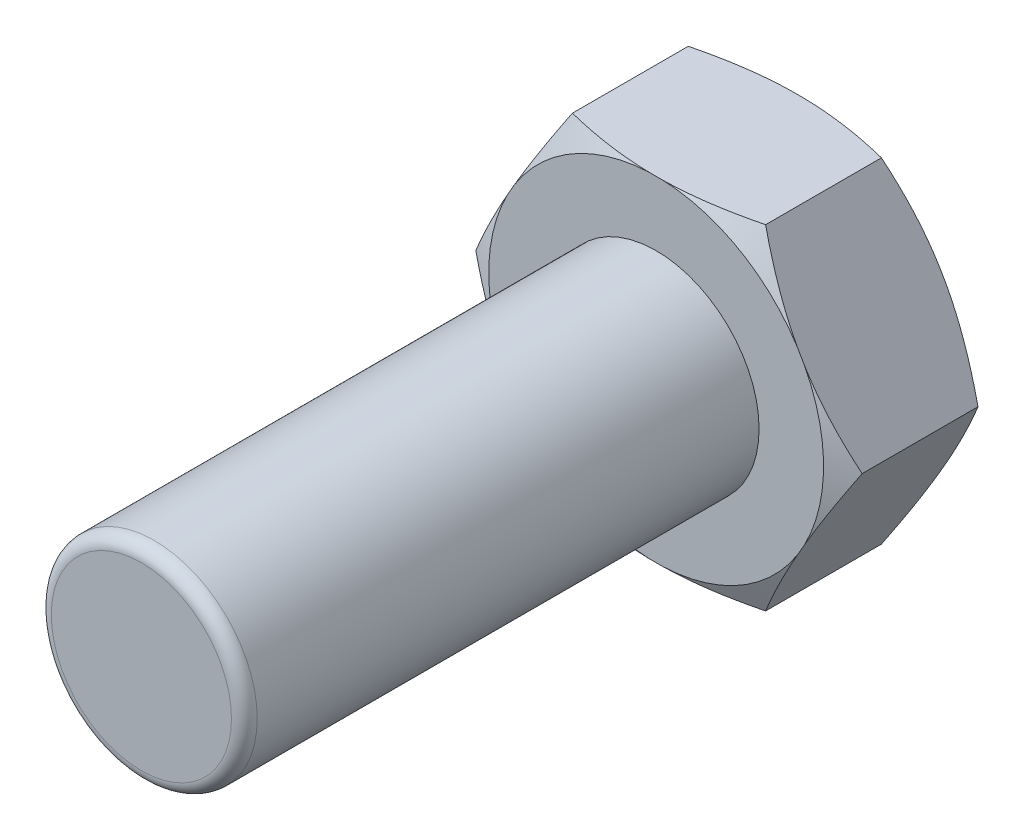
ISO-10303-21;
HEADER;
FILE_DESCRIPTION(('STEP AP214'),'2;1');
FILE_NAME('part.step','',(''),(''),'','','');
FILE_SCHEMA(('AUTOMOTIVE_DESIGN { 1 0 10303 214 1 1 1 1 }'));
ENDSEC;
DATA;
#1=APPLICATION_CONTEXT('core data for automotive mechanical design processes');
#2=APPLICATION_PROTOCOL_DEFINITION('international standard','automotive_design',2000,#1);
#3=PRODUCT_CONTEXT('',#1,'mechanical');
#4=PRODUCT('Part','Part','',(#3));
#5=PRODUCT_RELATED_PRODUCT_CATEGORY('part','',(#4));
#6=PRODUCT_DEFINITION_FORMATION('','',#4);
#7=PRODUCT_DEFINITION_CONTEXT('part definition',#1,'design');
#8=PRODUCT_DEFINITION('design','',#6,#7);
#9=PRODUCT_DEFINITION_SHAPE('','',#8);
#10=(LENGTH_UNIT() NAMED_UNIT(*) SI_UNIT(.MILLI.,.METRE.));
#11=(NAMED_UNIT(*) PLANE_ANGLE_UNIT() SI_UNIT($,.RADIAN.));
#12=(NAMED_UNIT(*) SI_UNIT($,.STERADIAN.) SOLID_ANGLE_UNIT());
#13=UNCERTAINTY_MEASURE_WITH_UNIT(LENGTH_MEASURE(1.E-05),#10,'distance_accuracy_value','');
#14=(GEOMETRIC_REPRESENTATION_CONTEXT(3) GLOBAL_UNCERTAINTY_ASSIGNED_CONTEXT((#13)) GLOBAL_UNIT_ASSIGNED_CONTEXT((#10,
#11,#12)) REPRESENTATION_CONTEXT('',''));
#15=CARTESIAN_POINT('',(0.,0.,0.));
#16=DIRECTION('',(0.,0.,1.));
#17=DIRECTION('',(1.,0.,0.));
#18=AXIS2_PLACEMENT_3D('',#15,#16,#17);
#19=CARTESIAN_POINT('',(0.,0.,5.5));
#20=DIRECTION('',(0.,0.,1.));
#21=DIRECTION('',(1.,0.,0.));
#22=AXIS2_PLACEMENT_3D('',#19,#20,#21);
#23=PLANE('',#22);
#24=CARTESIAN_POINT('',(0.,0.,5.5));
#25=DIRECTION('',(0.,0.,1.));
#26=DIRECTION('',(1.,0.,0.));
#27=AXIS2_PLACEMENT_3D('',#24,#25,#26);
#28=CIRCLE('',#27,4.);
#29=CARTESIAN_POINT('',(4.,0.,5.5));
#30=VERTEX_POINT('',#29);
#31=EDGE_CURVE('E219',#30,#30,#28,.T.);
#32=ORIENTED_EDGE('',*,*,#31,.F.);
#33=EDGE_LOOP('',(#32));
#34=FACE_BOUND('',#33,.T.);
#35=CARTESIAN_POINT('',(0.,0.,5.5));
#36=DIRECTION('',(0.,0.,1.));
#37=DIRECTION('',(1.,0.,0.));
#38=AXIS2_PLACEMENT_3D('',#35,#36,#37);
#39=CIRCLE('',#38,6.50555349946514);
#40=CARTESIAN_POINT('',(5.49479033678218,-3.48274395975477,5.5));
#41=VERTEX_POINT('',#40);
#42=CARTESIAN_POINT('',(0.268749575633286,-6.5,5.5));
#43=VERTEX_POINT('',#42);
#44=EDGE_CURVE('E226',#41,#43,#39,.F.);
#45=ORIENTED_EDGE('',*,*,#44,.F.);
#46=DIRECTION('',(0.5,0.866025403784439,0.));
#47=VECTOR('',#46,1.);
#48=CARTESIAN_POINT('',(3.75277674973257,-6.5,5.5));
#49=LINE('',#48,#47);
#50=CARTESIAN_POINT('',(5.76353991241553,-3.01725604024523,5.5));
#51=VERTEX_POINT('',#50);
#52=EDGE_CURVE('E202',#41,#51,#49,.T.);
#53=ORIENTED_EDGE('',*,*,#52,.T.);
#54=CARTESIAN_POINT('',(5.76353991241553,3.01725604024522,5.5));
#55=VERTEX_POINT('',#54);
#56=EDGE_CURVE('E224',#55,#51,#39,.F.);
#57=ORIENTED_EDGE('',*,*,#56,.F.);
#58=DIRECTION('',(-0.5,0.866025403784439,0.));
#59=VECTOR('',#58,1.);
#60=CARTESIAN_POINT('',(7.50555349946513,0.,5.5));
#61=LINE('',#60,#59);
#62=CARTESIAN_POINT('',(5.49479033678217,3.48274395975478,5.5));
#63=VERTEX_POINT('',#62);
#64=EDGE_CURVE('E257',#55,#63,#61,.T.);
#65=ORIENTED_EDGE('',*,*,#64,.T.);
#66=CARTESIAN_POINT('',(0.268749575633261,6.5,5.5));
#67=VERTEX_POINT('',#66);
#68=EDGE_CURVE('E225',#67,#63,#39,.F.);
#69=ORIENTED_EDGE('',*,*,#68,.F.);
#70=DIRECTION('',(-1.,0.,0.));
#71=VECTOR('',#70,1.);
#72=CARTESIAN_POINT('',(3.75277674973256,6.5,5.5));
#73=LINE('',#72,#71);
#74=CARTESIAN_POINT('',(-0.268749575633261,6.5,5.5));
#75=VERTEX_POINT('',#74);
#76=EDGE_CURVE('E263',#67,#75,#73,.T.);
#77=ORIENTED_EDGE('',*,*,#76,.T.);
#78=CARTESIAN_POINT('',(-5.4947903367822,3.48274395975472,5.5));
#79=VERTEX_POINT('',#78);
#80=EDGE_CURVE('E236',#79,#75,#39,.F.);
#81=ORIENTED_EDGE('',*,*,#80,.F.);
#82=DIRECTION('',(-0.5,-0.866025403784439,0.));
#83=VECTOR('',#82,1.);
#84=CARTESIAN_POINT('',(-3.75277674973257,6.5,5.5));
#85=LINE('',#84,#83);
#86=CARTESIAN_POINT('',(-5.7635399124155,3.01725604024527,5.5));
#87=VERTEX_POINT('',#86);
#88=EDGE_CURVE('E265',#79,#87,#85,.T.);
#89=ORIENTED_EDGE('',*,*,#88,.T.);
#90=CARTESIAN_POINT('',(-5.76353991241548,-3.01725604024531,5.5));
#91=VERTEX_POINT('',#90);
#92=EDGE_CURVE('E234',#91,#87,#39,.F.);
#93=ORIENTED_EDGE('',*,*,#92,.F.);
#94=DIRECTION('',(0.5,-0.866025403784438,0.));
#95=VECTOR('',#94,1.);
#96=CARTESIAN_POINT('',(-7.50555349946514,0.,5.5));
#97=LINE('',#96,#95);
#98=CARTESIAN_POINT('',(-5.49479033678222,-3.48274395975469,5.5));
#99=VERTEX_POINT('',#98);
#100=EDGE_CURVE('E272',#91,#99,#97,.T.);
#101=ORIENTED_EDGE('',*,*,#100,.T.);
#102=CARTESIAN_POINT('',(-0.268749575633286,-6.5,5.5));
#103=VERTEX_POINT('',#102);
#104=EDGE_CURVE('E230',#103,#99,#39,.F.);
#105=ORIENTED_EDGE('',*,*,#104,.F.);
#106=DIRECTION('',(1.,0.,0.));
#107=VECTOR('',#106,1.);
#108=CARTESIAN_POINT('',(-3.75277674973257,-6.5,5.5));
#109=LINE('',#108,#107);
#110=EDGE_CURVE('E207',#103,#43,#109,.T.);
#111=ORIENTED_EDGE('',*,*,#110,.T.);
#112=EDGE_LOOP('',(#45,#53,#57,#65,#69,#77,#81,#89,#93,#101,#105,#111));
#113=FACE_BOUND('',#112,.T.);
#114=ADVANCED_FACE('F38',(#34,#113),#23,.T.);
#115=CARTESIAN_POINT('',(0.,0.,0.));
#116=DIRECTION('',(0.,0.,1.));
#117=DIRECTION('',(1.,0.,0.));
#118=AXIS2_PLACEMENT_3D('',#115,#116,#117);
#119=PLANE('',#118);
#120=DIRECTION('',(0.5,0.866025403784439,0.));
#121=VECTOR('',#120,1.);
#122=CARTESIAN_POINT('',(3.75277674973257,-6.5,0.));
#123=LINE('',#122,#121);
#124=CARTESIAN_POINT('',(5.49479033678218,-3.48274395975477,0.));
#125=VERTEX_POINT('',#124);
#126=CARTESIAN_POINT('',(5.76353991241553,-3.01725604024523,0.));
#127=VERTEX_POINT('',#126);
#128=EDGE_CURVE('E277',#125,#127,#123,.T.);
#129=ORIENTED_EDGE('',*,*,#128,.F.);
#130=CARTESIAN_POINT('',(0.,0.,0.));
#131=DIRECTION('',(0.,0.,1.));
#132=DIRECTION('',(1.,0.,0.));
#133=AXIS2_PLACEMENT_3D('',#130,#131,#132);
#134=CIRCLE('',#133,6.50555349946514);
#135=CARTESIAN_POINT('',(0.268749575633286,-6.5,0.));
#136=VERTEX_POINT('',#135);
#137=EDGE_CURVE('E223',#125,#136,#134,.F.);
#138=ORIENTED_EDGE('',*,*,#137,.T.);
#139=DIRECTION('',(1.,0.,0.));
#140=VECTOR('',#139,1.);
#141=CARTESIAN_POINT('',(-3.75277674973257,-6.5,0.));
#142=LINE('',#141,#140);
#143=CARTESIAN_POINT('',(-0.268749575633286,-6.5,0.));
#144=VERTEX_POINT('',#143);
#145=EDGE_CURVE('E194',#144,#136,#142,.T.);
#146=ORIENTED_EDGE('',*,*,#145,.F.);
#147=CARTESIAN_POINT('',(-5.49479033678222,-3.48274395975469,0.));
#148=VERTEX_POINT('',#147);
#149=EDGE_CURVE('E595',#144,#148,#134,.F.);
#150=ORIENTED_EDGE('',*,*,#149,.T.);
#151=DIRECTION('',(0.5,-0.866025403784438,0.));
#152=VECTOR('',#151,1.);
#153=CARTESIAN_POINT('',(-7.50555349946514,0.,0.));
#154=LINE('',#153,#152);
#155=CARTESIAN_POINT('',(-5.76353991241548,-3.01725604024531,0.));
#156=VERTEX_POINT('',#155);
#157=EDGE_CURVE('E190',#156,#148,#154,.T.);
#158=ORIENTED_EDGE('',*,*,#157,.F.);
#159=CARTESIAN_POINT('',(-5.7635399124155,3.01725604024527,0.));
#160=VERTEX_POINT('',#159);
#161=EDGE_CURVE('E172',#156,#160,#134,.F.);
#162=ORIENTED_EDGE('',*,*,#161,.T.);
#163=DIRECTION('',(-0.5,-0.866025403784439,0.));
#164=VECTOR('',#163,1.);
#165=CARTESIAN_POINT('',(-3.75277674973257,6.5,0.));
#166=LINE('',#165,#164);
#167=CARTESIAN_POINT('',(-5.4947903367822,3.48274395975472,0.));
#168=VERTEX_POINT('',#167);
#169=EDGE_CURVE('E180',#168,#160,#166,.T.);
#170=ORIENTED_EDGE('',*,*,#169,.F.);
#171=CARTESIAN_POINT('',(-0.268749575633261,6.5,0.));
#172=VERTEX_POINT('',#171);
#173=EDGE_CURVE('E162',#168,#172,#134,.F.);
#174=ORIENTED_EDGE('',*,*,#173,.T.);
#175=DIRECTION('',(-1.,0.,0.));
#176=VECTOR('',#175,1.);
#177=CARTESIAN_POINT('',(3.75277674973256,6.5,0.));
#178=LINE('',#177,#176);
#179=CARTESIAN_POINT('',(0.268749575633261,6.5,0.));
#180=VERTEX_POINT('',#179);
#181=EDGE_CURVE('E191',#180,#172,#178,.T.);
#182=ORIENTED_EDGE('',*,*,#181,.F.);
#183=CARTESIAN_POINT('',(5.49479033678217,3.48274395975478,0.));
#184=VERTEX_POINT('',#183);
#185=EDGE_CURVE('E173',#180,#184,#134,.F.);
#186=ORIENTED_EDGE('',*,*,#185,.T.);
#187=DIRECTION('',(-0.5,0.866025403784439,0.));
#188=VECTOR('',#187,1.);
#189=CARTESIAN_POINT('',(7.50555349946513,0.,0.));
#190=LINE('',#189,#188);
#191=CARTESIAN_POINT('',(5.76353991241553,3.01725604024522,0.));
#192=VERTEX_POINT('',#191);
#193=EDGE_CURVE('E196',#192,#184,#190,.T.);
#194=ORIENTED_EDGE('',*,*,#193,.F.);
#195=EDGE_CURVE('E220',#192,#127,#134,.F.);
#196=ORIENTED_EDGE('',*,*,#195,.T.);
#197=EDGE_LOOP('',(#129,#138,#146,#150,#158,#162,#170,#174,#182,#186,#194,#196));
#198=FACE_BOUND('',#197,.T.);
#199=ADVANCED_FACE('F188',(#198),#119,.F.);
#200=CARTESIAN_POINT('',(3.75277674973257,-6.5,5.5));
#201=DIRECTION('',(-0.866025403784439,0.5,0.));
#202=DIRECTION('',(-0.5,-0.866025403784439,0.));
#203=AXIS2_PLACEMENT_3D('',#200,#201,#202);
#204=PLANE('',#203);
#205=DIRECTION('',(0.,0.,-1.));
#206=VECTOR('',#205,1.);
#207=CARTESIAN_POINT('',(3.75277674973257,-6.5,5.5));
#208=LINE('',#207,#206);
#209=CARTESIAN_POINT('',(3.75277674973257,-6.5,5.));
#210=VERTEX_POINT('',#209);
#211=CARTESIAN_POINT('',(3.75277674973257,-6.5,0.5));
#212=VERTEX_POINT('',#211);
#213=EDGE_CURVE('E203',#210,#212,#208,.T.);
#214=ORIENTED_EDGE('',*,*,#213,.T.);
#215=CARTESIAN_POINT('',(3.75237260454413,-6.5007,0.500202088914585));
#216=CARTESIAN_POINT('',(3.8581513468533,-6.3174858439598,0.447308100414797));
#217=CARTESIAN_POINT('',(3.96434221026252,-6.13355787323541,0.397552458642436));
#218=CARTESIAN_POINT('',(4.17756983432187,-5.76423679478743,0.305365614830753));
#219=CARTESIAN_POINT('',(4.28460700117574,-5.57884298349829,0.262938185371068));
#220=CARTESIAN_POINT('',(4.49959934134498,-5.20646532708704,0.186455410870334));
#221=CARTESIAN_POINT('',(4.60755563959989,-5.01947953351247,0.152412559968943));
#222=CARTESIAN_POINT('',(4.82409838792355,-4.6444164914053,0.0938297029314832));
#223=CARTESIAN_POINT('',(4.93268472608622,-4.4563394366997,0.0692880586741505));
#224=CARTESIAN_POINT('',(5.1478553862202,-4.0836529210495,0.031003092263815));
#225=CARTESIAN_POINT('',(5.25442927124948,-3.89906153741879,0.0170275284853245));
#226=CARTESIAN_POINT('',(5.4677990566594,-3.52949422828874,-0.000510400439065489));
#227=CARTESIAN_POINT('',(5.57459496772756,-3.34451828427808,-0.00407225212184421));
#228=CARTESIAN_POINT('',(5.78802860217816,-2.97484038536555,-0.000644602363145451));
#229=CARTESIAN_POINT('',(5.8946663719813,-2.79013835006069,0.00633352888495326));
#230=CARTESIAN_POINT('',(6.10763808623,-2.42126052040688,0.0305511734218139));
#231=CARTESIAN_POINT('',(6.21397205579703,-2.23708468254632,0.0477898120447853));
#232=CARTESIAN_POINT('',(6.41948815126255,-1.88112036342686,0.0905216057624534));
#233=CARTESIAN_POINT('',(6.5187011062663,-1.70927848459131,0.11543017165032));
#234=CARTESIAN_POINT('',(6.71656951926134,-1.36656034007088,0.173005823171236));
#235=CARTESIAN_POINT('',(6.81522491642766,-1.19568417973793,0.205673739175031));
#236=CARTESIAN_POINT('',(7.01298812041286,-0.853148262567952,0.278357612028755));
#237=CARTESIAN_POINT('',(7.11208869539026,-0.681501031647809,0.318451480294036));
#238=CARTESIAN_POINT('',(7.30956235262323,-0.339466624163873,0.404867578606761));
#239=CARTESIAN_POINT('',(7.40793575289547,-0.169078896779033,0.451186892347521));
#240=CARTESIAN_POINT('',(7.50595764465357,0.000700000000001562,0.500202088914583));
#241=B_SPLINE_CURVE_WITH_KNOTS('',3,(#215,#216,#217,#218,#219,#220,#221,#222,#223,#224,#225,
#226,#227,#228,#229,#230,#231,#232,#233,#234,#235,#236,#237,#238,#239,#240),.UNSPECIFIED.,.F.,
.F.,(4,2,2,2,2,2,2,2,2,2,2,2,4),(0.,0.654242187553569,1.30882018300877,1.96436776438002,
2.61980227114733,3.26037426611438,3.90097784487654,4.54089085456767,5.18074932213415,
5.78053406899308,6.38038303105972,6.98692412571604,7.59318207044967),.UNSPECIFIED.);
#242=EDGE_CURVE('E335',#212,#125,#241,.T.);
#243=ORIENTED_EDGE('',*,*,#242,.T.);
#244=ORIENTED_EDGE('',*,*,#128,.T.);
#245=CARTESIAN_POINT('',(7.50555349946514,0.,0.5));
#246=VERTEX_POINT('',#245);
#247=EDGE_CURVE('E602',#127,#246,#241,.T.);
#248=ORIENTED_EDGE('',*,*,#247,.T.);
#249=DIRECTION('',(0.,0.,-1.));
#250=VECTOR('',#249,1.);
#251=CARTESIAN_POINT('',(7.50555349946513,0.,5.5));
#252=LINE('',#251,#250);
#253=CARTESIAN_POINT('',(7.50555349946514,0.,5.));
#254=VERTEX_POINT('',#253);
#255=EDGE_CURVE('E217',#254,#246,#252,.T.);
#256=ORIENTED_EDGE('',*,*,#255,.F.);
#257=CARTESIAN_POINT('',(7.50595764465357,0.000700000000001858,4.99979791108542));
#258=CARTESIAN_POINT('',(7.4001789023444,-0.182514156040201,5.0526918995852));
#259=CARTESIAN_POINT('',(7.29398803893518,-0.366442126764588,5.10244754135756));
#260=CARTESIAN_POINT('',(7.08076041487583,-0.735763205212568,5.19463438516925));
#261=CARTESIAN_POINT('',(6.97372324802196,-0.921157016501705,5.23706181462893));
#262=CARTESIAN_POINT('',(6.75873090785272,-1.29353467291295,5.31354458912967));
#263=CARTESIAN_POINT('',(6.65077460959781,-1.48052046648752,5.34758744003106));
#264=CARTESIAN_POINT('',(6.43423186127415,-1.8555835085947,5.40617029706852));
#265=CARTESIAN_POINT('',(6.32564552311148,-2.0436605633003,5.43071194132585));
#266=CARTESIAN_POINT('',(6.1104748629775,-2.41634707895049,5.46899690773619));
#267=CARTESIAN_POINT('',(6.00390097794822,-2.6009384625812,5.48297247151467));
#268=CARTESIAN_POINT('',(5.7905311925383,-2.97050577171125,5.50051040043907));
#269=CARTESIAN_POINT('',(5.68373528147015,-3.15548171572191,5.50407225212184));
#270=CARTESIAN_POINT('',(5.47030164701954,-3.52515961463445,5.50064460236315));
#271=CARTESIAN_POINT('',(5.36366387721641,-3.70986164993931,5.49366647111505));
#272=CARTESIAN_POINT('',(5.1506921629677,-4.07873947959311,5.46944882657819));
#273=CARTESIAN_POINT('',(5.04435819340067,-4.26291531745367,5.45221018795521));
#274=CARTESIAN_POINT('',(4.83884209793515,-4.61887963657314,5.40947839423755));
#275=CARTESIAN_POINT('',(4.7396291429314,-4.79072151540868,5.38456982834968));
#276=CARTESIAN_POINT('',(4.54176072993636,-5.13343965992911,5.32699417682876));
#277=CARTESIAN_POINT('',(4.44310533277004,-5.30431582026207,5.29432626082497));
#278=CARTESIAN_POINT('',(4.24534212878484,-5.64685173743205,5.22164238797124));
#279=CARTESIAN_POINT('',(4.14624155380744,-5.81849896835219,5.18154851970596));
#280=CARTESIAN_POINT('',(3.94876789657447,-6.16053337583612,5.09513242139324));
#281=CARTESIAN_POINT('',(3.85039449630223,-6.33092110322097,5.04881310765248));
#282=CARTESIAN_POINT('',(3.75237260454413,-6.5007,4.99979791108542));
#283=B_SPLINE_CURVE_WITH_KNOTS('',3,(#257,#258,#259,#260,#261,#262,#263,#264,#265,#266,#267,
#268,#269,#270,#271,#272,#273,#274,#275,#276,#277,#278,#279,#280,#281,#282),.UNSPECIFIED.,.F.,
.F.,(4,2,2,2,2,2,2,2,2,2,2,2,4),(0.,0.654242187553568,1.30882018300877,1.96436776438002,
2.61980227114733,3.26037426611438,3.90097784487653,4.54089085456766,5.18074932213414,
5.78053406899307,6.38038303105972,6.98692412571604,7.59318207044967),.UNSPECIFIED.);
#284=EDGE_CURVE('E279',#254,#51,#283,.T.);
#285=ORIENTED_EDGE('',*,*,#284,.T.);
#286=ORIENTED_EDGE('',*,*,#52,.F.);
#287=EDGE_CURVE('E371',#41,#210,#283,.T.);
#288=ORIENTED_EDGE('',*,*,#287,.T.);
#289=EDGE_LOOP('',(#214,#243,#244,#248,#256,#285,#286,#288));
#290=FACE_BOUND('',#289,.T.);
#291=ADVANCED_FACE('F384',(#290),#204,.F.);
#292=CARTESIAN_POINT('',(7.50555349946513,0.,5.5));
#293=DIRECTION('',(-0.866025403784439,-0.5,0.));
#294=DIRECTION('',(0.5,-0.866025403784439,0.));
#295=AXIS2_PLACEMENT_3D('',#292,#293,#294);
#296=PLANE('',#295);
#297=ORIENTED_EDGE('',*,*,#255,.T.);
#298=CARTESIAN_POINT('',(7.50595764465356,-0.00069999999999797,0.500202088914583));
#299=CARTESIAN_POINT('',(7.4001789023444,0.182514156040205,0.447308100414796));
#300=CARTESIAN_POINT('',(7.29398803893518,0.366442126764592,0.397552458642435));
#301=CARTESIAN_POINT('',(7.08076041487583,0.735763205212573,0.305365614830752));
#302=CARTESIAN_POINT('',(6.97372324802196,0.921157016501709,0.262938185371066));
#303=CARTESIAN_POINT('',(6.75873090785272,1.29353467291296,0.186455410870333));
#304=CARTESIAN_POINT('',(6.65077460959781,1.48052046648753,0.152412559968942));
#305=CARTESIAN_POINT('',(6.43423186127415,1.85558350859471,0.0938297029314831));
#306=CARTESIAN_POINT('',(6.32564552311148,2.0436605633003,0.0692880586741502));
#307=CARTESIAN_POINT('',(6.1104748629775,2.4163470789505,0.0310030922638145));
#308=CARTESIAN_POINT('',(6.00390097794822,2.60093846258121,0.0170275284853243));
#309=CARTESIAN_POINT('',(5.7905311925383,2.97050577171126,-0.000510400439065394));
#310=CARTESIAN_POINT('',(5.68373528147014,3.15548171572192,-0.00407225212184394));
#311=CARTESIAN_POINT('',(5.47030164701954,3.52515961463445,-0.000644602363145258));
#312=CARTESIAN_POINT('',(5.3636638772164,3.70986164993931,0.00633352888495324));
#313=CARTESIAN_POINT('',(5.15069216296769,4.07873947959312,0.0305511734218142));
#314=CARTESIAN_POINT('',(5.04435819340067,4.26291531745368,0.0477898120447861));
#315=CARTESIAN_POINT('',(4.83884209793515,4.61887963657314,0.0905216057624544));
#316=CARTESIAN_POINT('',(4.7396291429314,4.79072151540869,0.115430171650321));
#317=CARTESIAN_POINT('',(4.54176072993636,5.13343965992912,0.173005823171237));
#318=CARTESIAN_POINT('',(4.44310533277004,5.30431582026207,0.205673739175032));
#319=CARTESIAN_POINT('',(4.24534212878483,5.64685173743205,0.278357612028756));
#320=CARTESIAN_POINT('',(4.14624155380744,5.81849896835219,0.318451480294037));
#321=CARTESIAN_POINT('',(3.94876789657447,6.16053337583613,0.404867578606762));
#322=CARTESIAN_POINT('',(3.85039449630223,6.33092110322097,0.451186892347522));
#323=CARTESIAN_POINT('',(3.75237260454413,6.5007,0.500202088914585));
#324=B_SPLINE_CURVE_WITH_KNOTS('',3,(#298,#299,#300,#301,#302,#303,#304,#305,#306,#307,#308,
#309,#310,#311,#312,#313,#314,#315,#316,#317,#318,#319,#320,#321,#322,#323),.UNSPECIFIED.,.F.,
.F.,(4,2,2,2,2,2,2,2,2,2,2,2,4),(0.,0.654242187553569,1.30882018300877,1.96436776438002,
2.61980227114733,3.26037426611438,3.90097784487654,4.54089085456767,5.18074932213415,
5.78053406899307,6.38038303105972,6.98692412571604,7.59318207044967),.UNSPECIFIED.);
#325=EDGE_CURVE('E284',#246,#192,#324,.T.);
#326=ORIENTED_EDGE('',*,*,#325,.T.);
#327=ORIENTED_EDGE('',*,*,#193,.T.);
#328=CARTESIAN_POINT('',(3.75277674973257,6.5,0.5));
#329=VERTEX_POINT('',#328);
#330=EDGE_CURVE('E283',#184,#329,#324,.T.);
#331=ORIENTED_EDGE('',*,*,#330,.T.);
#332=DIRECTION('',(0.,0.,-1.));
#333=VECTOR('',#332,1.);
#334=CARTESIAN_POINT('',(3.75277674973256,6.5,5.5));
#335=LINE('',#334,#333);
#336=CARTESIAN_POINT('',(3.75277674973257,6.5,5.));
#337=VERTEX_POINT('',#336);
#338=EDGE_CURVE('E214',#337,#329,#335,.T.);
#339=ORIENTED_EDGE('',*,*,#338,.F.);
#340=CARTESIAN_POINT('',(3.75237260454413,6.5007,4.99979791108542));
#341=CARTESIAN_POINT('',(3.85815134685329,6.3174858439598,5.0526918995852));
#342=CARTESIAN_POINT('',(3.96434221026252,6.13355787323541,5.10244754135756));
#343=CARTESIAN_POINT('',(4.17756983432187,5.76423679478743,5.19463438516925));
#344=CARTESIAN_POINT('',(4.28460700117574,5.57884298349829,5.23706181462893));
#345=CARTESIAN_POINT('',(4.49959934134498,5.20646532708704,5.31354458912967));
#346=CARTESIAN_POINT('',(4.60755563959989,5.01947953351247,5.34758744003106));
#347=CARTESIAN_POINT('',(4.82409838792355,4.6444164914053,5.40617029706852));
#348=CARTESIAN_POINT('',(4.93268472608622,4.4563394366997,5.43071194132585));
#349=CARTESIAN_POINT('',(5.1478553862202,4.08365292104951,5.46899690773619));
#350=CARTESIAN_POINT('',(5.25442927124948,3.89906153741879,5.48297247151467));
#351=CARTESIAN_POINT('',(5.4677990566594,3.52949422828874,5.50051040043907));
#352=CARTESIAN_POINT('',(5.57459496772755,3.34451828427809,5.50407225212184));
#353=CARTESIAN_POINT('',(5.78802860217816,2.97484038536555,5.50064460236315));
#354=CARTESIAN_POINT('',(5.8946663719813,2.79013835006069,5.49366647111505));
#355=CARTESIAN_POINT('',(6.10763808623,2.42126052040689,5.46944882657819));
#356=CARTESIAN_POINT('',(6.21397205579703,2.23708468254632,5.45221018795521));
#357=CARTESIAN_POINT('',(6.41948815126255,1.88112036342686,5.40947839423755));
#358=CARTESIAN_POINT('',(6.5187011062663,1.70927848459132,5.38456982834968));
#359=CARTESIAN_POINT('',(6.71656951926134,1.36656034007089,5.32699417682876));
#360=CARTESIAN_POINT('',(6.81522491642766,1.19568417973793,5.29432626082497));
#361=CARTESIAN_POINT('',(7.01298812041286,0.853148262567956,5.22164238797124));
#362=CARTESIAN_POINT('',(7.11208869539026,0.681501031647813,5.18154851970596));
#363=CARTESIAN_POINT('',(7.30956235262322,0.339466624163877,5.09513242139324));
#364=CARTESIAN_POINT('',(7.40793575289547,0.169078896779037,5.04881310765248));
#365=CARTESIAN_POINT('',(7.50595764465356,-0.000699999999997427,4.99979791108542));
#366=B_SPLINE_CURVE_WITH_KNOTS('',3,(#340,#341,#342,#343,#344,#345,#346,#347,#348,#349,#350,
#351,#352,#353,#354,#355,#356,#357,#358,#359,#360,#361,#362,#363,#364,#365),.UNSPECIFIED.,.F.,
.F.,(4,2,2,2,2,2,2,2,2,2,2,2,4),(0.,0.65424218755357,1.30882018300877,1.96436776438002,
2.61980227114733,3.26037426611438,3.90097784487654,4.54089085456767,5.18074932213415,
5.78053406899307,6.38038303105972,6.98692412571604,7.59318207044967),.UNSPECIFIED.);
#367=EDGE_CURVE('E245',#337,#63,#366,.T.);
#368=ORIENTED_EDGE('',*,*,#367,.T.);
#369=ORIENTED_EDGE('',*,*,#64,.F.);
#370=EDGE_CURVE('E259',#55,#254,#366,.T.);
#371=ORIENTED_EDGE('',*,*,#370,.T.);
#372=EDGE_LOOP('',(#297,#326,#327,#331,#339,#368,#369,#371));
#373=FACE_BOUND('',#372,.T.);
#374=ADVANCED_FACE('F255',(#373),#296,.F.);
#375=CARTESIAN_POINT('',(3.75277674973256,6.5,5.5));
#376=DIRECTION('',(0.,-1.,0.));
#377=DIRECTION('',(0.,0.,-1.));
#378=AXIS2_PLACEMENT_3D('',#375,#376,#377);
#379=PLANE('',#378);
#380=ORIENTED_EDGE('',*,*,#338,.T.);
#381=CARTESIAN_POINT('',(3.75347674973256,6.5,0.500175012240365));
#382=CARTESIAN_POINT('',(3.54192162519923,6.5,0.447282755969558));
#383=CARTESIAN_POINT('',(3.32954227379659,6.5,0.397528857024414));
#384=CARTESIAN_POINT('',(2.90309182650538,6.5,0.305345485202523));
#385=CARTESIAN_POINT('',(2.68901991825973,6.5,0.262919784770842));
#386=CARTESIAN_POINT('',(2.25904019363984,6.5,0.186440425956892));
#387=CARTESIAN_POINT('',(2.04313012776865,6.5,0.152399260005533));
#388=CARTESIAN_POINT('',(1.6100497632385,6.5,0.0938196616704836));
#389=CARTESIAN_POINT('',(1.39287968837432,6.5,0.0692795912208281));
#390=CARTESIAN_POINT('',(0.962543417507529,6.5,0.0309975490733606));
#391=CARTESIAN_POINT('',(0.749398092974236,6.5,0.0170233475587274));
#392=CARTESIAN_POINT('',(0.322663478736452,6.5,-0.000512066325803271));
#393=CARTESIAN_POINT('',(0.109074167659224,6.5,-0.00407276522012902));
#394=CARTESIAN_POINT('',(-0.31778804759895,6.5,-0.000643068305750199));
#395=CARTESIAN_POINT('',(-0.531061044668984,6.5,0.00633595837845697));
#396=CARTESIAN_POINT('',(-0.95699936095713,6.5,0.0305551115069941));
#397=CARTESIAN_POINT('',(-1.16966473042201,6.5,0.0477943632817789));
#398=CARTESIAN_POINT('',(-1.58068117508018,6.5,0.0905259486290271));
#399=CARTESIAN_POINT('',(-1.77909395716747,6.5,0.115433252203116));
#400=CARTESIAN_POINT('',(-2.17480466284762,6.5,0.173005342178703));
#401=CARTESIAN_POINT('',(-2.3721024648757,6.5,0.205670958367692));
#402=CARTESIAN_POINT('',(-2.76760272502698,6.5,0.278349291876491));
#403=CARTESIAN_POINT('',(-2.96579072274422,6.5,0.318439903827291));
#404=CARTESIAN_POINT('',(-3.360711947741,6.5,0.404848758409281));
#405=CARTESIAN_POINT('',(-3.5574458108006,6.5,0.451164085844501));
#406=CARTESIAN_POINT('',(-3.75347674973257,6.5,0.500175012240366));
#407=B_SPLINE_CURVE_WITH_KNOTS('',3,(#381,#382,#383,#384,#385,#386,#387,#388,#389,#390,#391,
#392,#393,#394,#395,#396,#397,#398,#399,#400,#401,#402,#403,#404,#405,#406),.UNSPECIFIED.,.F.,
.F.,(4,2,2,2,2,2,2,2,2,2,2,2,4),(0.,0.654234056420655,1.30880390529539,1.96434320152268,
2.61976942707328,3.26033383975563,3.9009298372606,4.54083532196571,5.18068626345358,
5.78043149769994,6.38024090638788,6.98674140943669,7.5929588559283),.UNSPECIFIED.);
#408=EDGE_CURVE('E289',#329,#180,#407,.T.);
#409=ORIENTED_EDGE('',*,*,#408,.T.);
#410=ORIENTED_EDGE('',*,*,#181,.T.);
#411=CARTESIAN_POINT('',(-3.75277674973257,6.5,0.5));
#412=VERTEX_POINT('',#411);
#413=EDGE_CURVE('E167',#172,#412,#407,.T.);
#414=ORIENTED_EDGE('',*,*,#413,.T.);
#415=DIRECTION('',(0.,0.,-1.));
#416=VECTOR('',#415,1.);
#417=CARTESIAN_POINT('',(-3.75277674973257,6.5,5.5));
#418=LINE('',#417,#416);
#419=CARTESIAN_POINT('',(-3.75277674973257,6.5,5.));
#420=VERTEX_POINT('',#419);
#421=EDGE_CURVE('E183',#420,#412,#418,.T.);
#422=ORIENTED_EDGE('',*,*,#421,.F.);
#423=CARTESIAN_POINT('',(-3.75347674973257,6.5,4.99982498775963));
#424=CARTESIAN_POINT('',(-3.54192162519923,6.5,5.05271724403044));
#425=CARTESIAN_POINT('',(-3.32954227379659,6.5,5.10247114297559));
#426=CARTESIAN_POINT('',(-2.90309182650538,6.5,5.19465451479748));
#427=CARTESIAN_POINT('',(-2.68901991825973,6.5,5.23708021522916));
#428=CARTESIAN_POINT('',(-2.25904019363984,6.5,5.31355957404311));
#429=CARTESIAN_POINT('',(-2.04313012776865,6.5,5.34760073999447));
#430=CARTESIAN_POINT('',(-1.61004976323851,6.5,5.40618033832952));
#431=CARTESIAN_POINT('',(-1.39287968837432,6.5,5.43072040877917));
#432=CARTESIAN_POINT('',(-0.962543417507533,6.5,5.46900245092664));
#433=CARTESIAN_POINT('',(-0.749398092974241,6.5,5.48297665244127));
#434=CARTESIAN_POINT('',(-0.322663478736457,6.5,5.5005120663258));
#435=CARTESIAN_POINT('',(-0.10907416765923,6.5,5.50407276522013));
#436=CARTESIAN_POINT('',(0.317788047598944,6.5,5.50064306830575));
#437=CARTESIAN_POINT('',(0.531061044668979,6.5,5.49366404162154));
#438=CARTESIAN_POINT('',(0.956999360957123,6.5,5.46944488849301));
#439=CARTESIAN_POINT('',(1.16966473042201,6.5,5.45220563671822));
#440=CARTESIAN_POINT('',(1.58068117508018,6.5,5.40947405137097));
#441=CARTESIAN_POINT('',(1.77909395716747,6.5,5.38456674779688));
#442=CARTESIAN_POINT('',(2.17480466284761,6.5,5.3269946578213));
#443=CARTESIAN_POINT('',(2.3721024648757,6.5,5.29432904163231));
#444=CARTESIAN_POINT('',(2.76760272502698,6.5,5.22165070812351));
#445=CARTESIAN_POINT('',(2.96579072274422,6.5,5.18156009617271));
#446=CARTESIAN_POINT('',(3.360711947741,6.5,5.09515124159072));
#447=CARTESIAN_POINT('',(3.55744581080059,6.5,5.0488359141555));
#448=CARTESIAN_POINT('',(3.75347674973256,6.5,4.99982498775963));
#449=B_SPLINE_CURVE_WITH_KNOTS('',3,(#423,#424,#425,#426,#427,#428,#429,#430,#431,#432,#433,
#434,#435,#436,#437,#438,#439,#440,#441,#442,#443,#444,#445,#446,#447,#448),.UNSPECIFIED.,.F.,
.F.,(4,2,2,2,2,2,2,2,2,2,2,2,4),(0.,0.654234056420655,1.30880390529539,1.96434320152268,
2.61976942707328,3.26033383975563,3.9009298372606,4.54083532196571,5.18068626345358,
5.78043149769993,6.38024090638788,6.98674140943668,7.5929588559283),.UNSPECIFIED.);
#450=EDGE_CURVE('E396',#420,#75,#449,.T.);
#451=ORIENTED_EDGE('',*,*,#450,.T.);
#452=ORIENTED_EDGE('',*,*,#76,.F.);
#453=EDGE_CURVE('E247',#67,#337,#449,.T.);
#454=ORIENTED_EDGE('',*,*,#453,.T.);
#455=EDGE_LOOP('',(#380,#409,#410,#414,#422,#451,#452,#454));
#456=FACE_BOUND('',#455,.T.);
#457=ADVANCED_FACE('F291',(#456),#379,.F.);
#458=CARTESIAN_POINT('',(-3.75277674973257,6.5,5.5));
#459=DIRECTION('',(0.866025403784439,-0.5,0.));
#460=DIRECTION('',(0.5,0.866025403784439,0.));
#461=AXIS2_PLACEMENT_3D('',#458,#459,#460);
#462=PLANE('',#461);
#463=ORIENTED_EDGE('',*,*,#421,.T.);
#464=CARTESIAN_POINT('',(-3.75237260454414,6.5007,0.500202088914585));
#465=CARTESIAN_POINT('',(-3.8581513468533,6.3174858439598,0.447308100414798));
#466=CARTESIAN_POINT('',(-3.96434221026252,6.13355787323541,0.397552458642437));
#467=CARTESIAN_POINT('',(-4.17756983432187,5.76423679478743,0.305365614830754));
#468=CARTESIAN_POINT('',(-4.28460700117574,5.57884298349829,0.262938185371069));
#469=CARTESIAN_POINT('',(-4.49959934134498,5.20646532708704,0.186455410870335));
#470=CARTESIAN_POINT('',(-4.60755563959989,5.01947953351247,0.152412559968944));
#471=CARTESIAN_POINT('',(-4.82409838792355,4.6444164914053,0.0938297029314844));
#472=CARTESIAN_POINT('',(-4.93268472608622,4.4563394366997,0.069288058674152));
#473=CARTESIAN_POINT('',(-5.1478553862202,4.08365292104951,0.0310030922638162));
#474=CARTESIAN_POINT('',(-5.25442927124948,3.89906153741879,0.0170275284853252));
#475=CARTESIAN_POINT('',(-5.4677990566594,3.52949422828874,-0.000510400439064884));
#476=CARTESIAN_POINT('',(-5.57459496772756,3.34451828427809,-0.00407225212184326));
#477=CARTESIAN_POINT('',(-5.78802860217816,2.97484038536555,-0.000644602363144531));
#478=CARTESIAN_POINT('',(-5.8946663719813,2.79013835006069,0.00633352888495383));
#479=CARTESIAN_POINT('',(-6.10763808623001,2.42126052040689,0.0305511734218144));
#480=CARTESIAN_POINT('',(-6.21397205579703,2.23708468254632,0.0477898120447861));
#481=CARTESIAN_POINT('',(-6.41948815126255,1.88112036342686,0.0905216057624543));
#482=CARTESIAN_POINT('',(-6.5187011062663,1.70927848459132,0.115430171650321));
#483=CARTESIAN_POINT('',(-6.71656951926134,1.36656034007089,0.173005823171237));
#484=CARTESIAN_POINT('',(-6.81522491642766,1.19568417973793,0.205673739175032));
#485=CARTESIAN_POINT('',(-7.01298812041287,0.853148262567952,0.278357612028756));
#486=CARTESIAN_POINT('',(-7.11208869539026,0.681501031647809,0.318451480294037));
#487=CARTESIAN_POINT('',(-7.30956235262323,0.339466624163872,0.404867578606763));
#488=CARTESIAN_POINT('',(-7.40793575289548,0.169078896779031,0.451186892347523));
#489=CARTESIAN_POINT('',(-7.50595764465357,-0.000700000000003896,0.500202088914586));
#490=B_SPLINE_CURVE_WITH_KNOTS('',3,(#464,#465,#466,#467,#468,#469,#470,#471,#472,#473,#474,
#475,#476,#477,#478,#479,#480,#481,#482,#483,#484,#485,#486,#487,#488,#489),.UNSPECIFIED.,.F.,
.F.,(4,2,2,2,2,2,2,2,2,2,2,2,4),(0.,0.65424218755357,1.30882018300877,1.96436776438002,
2.61980227114733,3.26037426611438,3.90097784487654,4.54089085456767,5.18074932213415,
5.78053406899307,6.38038303105972,6.98692412571605,7.59318207044967),.UNSPECIFIED.);
#491=EDGE_CURVE('E165',#412,#168,#490,.T.);
#492=ORIENTED_EDGE('',*,*,#491,.T.);
#493=ORIENTED_EDGE('',*,*,#169,.T.);
#494=CARTESIAN_POINT('',(-7.50555349946514,0.,0.5));
#495=VERTEX_POINT('',#494);
#496=EDGE_CURVE('E184',#160,#495,#490,.T.);
#497=ORIENTED_EDGE('',*,*,#496,.T.);
#498=DIRECTION('',(0.,0.,-1.));
#499=VECTOR('',#498,1.);
#500=CARTESIAN_POINT('',(-7.50555349946514,0.,5.5));
#501=LINE('',#500,#499);
#502=CARTESIAN_POINT('',(-7.50555349946514,0.,5.));
#503=VERTEX_POINT('',#502);
#504=EDGE_CURVE('E210',#503,#495,#501,.T.);
#505=ORIENTED_EDGE('',*,*,#504,.F.);
#506=CARTESIAN_POINT('',(-7.50595764465357,-0.000700000000003274,4.99979791108541));
#507=CARTESIAN_POINT('',(-7.40017890234441,0.1825141560402,5.0526918995852));
#508=CARTESIAN_POINT('',(-7.29398803893518,0.366442126764587,5.10244754135756));
#509=CARTESIAN_POINT('',(-7.08076041487584,0.735763205212567,5.19463438516925));
#510=CARTESIAN_POINT('',(-6.97372324802196,0.921157016501703,5.23706181462893));
#511=CARTESIAN_POINT('',(-6.75873090785273,1.29353467291295,5.31354458912967));
#512=CARTESIAN_POINT('',(-6.65077460959781,1.48052046648752,5.34758744003106));
#513=CARTESIAN_POINT('',(-6.43423186127416,1.8555835085947,5.40617029706852));
#514=CARTESIAN_POINT('',(-6.32564552311149,2.0436605633003,5.43071194132585));
#515=CARTESIAN_POINT('',(-6.1104748629775,2.41634707895049,5.46899690773618));
#516=CARTESIAN_POINT('',(-6.00390097794823,2.6009384625812,5.48297247151467));
#517=CARTESIAN_POINT('',(-5.79053119253831,2.97050577171125,5.50051040043906));
#518=CARTESIAN_POINT('',(-5.68373528147015,3.15548171572191,5.50407225212184));
#519=CARTESIAN_POINT('',(-5.47030164701954,3.52515961463445,5.50064460236314));
#520=CARTESIAN_POINT('',(-5.36366387721641,3.70986164993931,5.49366647111504));
#521=CARTESIAN_POINT('',(-5.1506921629677,4.07873947959311,5.46944882657819));
#522=CARTESIAN_POINT('',(-5.04435819340068,4.26291531745367,5.45221018795521));
#523=CARTESIAN_POINT('',(-4.83884209793515,4.61887963657314,5.40947839423755));
#524=CARTESIAN_POINT('',(-4.7396291429314,4.79072151540868,5.38456982834968));
#525=CARTESIAN_POINT('',(-4.54176072993636,5.13343965992911,5.32699417682876));
#526=CARTESIAN_POINT('',(-4.44310533277004,5.30431582026207,5.29432626082497));
#527=CARTESIAN_POINT('',(-4.24534212878484,5.64685173743205,5.22164238797124));
#528=CARTESIAN_POINT('',(-4.14624155380744,5.81849896835219,5.18154851970596));
#529=CARTESIAN_POINT('',(-3.94876789657447,6.16053337583613,5.09513242139324));
#530=CARTESIAN_POINT('',(-3.85039449630223,6.33092110322097,5.04881310765248));
#531=CARTESIAN_POINT('',(-3.75237260454414,6.5007,4.99979791108541));
#532=B_SPLINE_CURVE_WITH_KNOTS('',3,(#506,#507,#508,#509,#510,#511,#512,#513,#514,#515,#516,
#517,#518,#519,#520,#521,#522,#523,#524,#525,#526,#527,#528,#529,#530,#531),.UNSPECIFIED.,.F.,
.F.,(4,2,2,2,2,2,2,2,2,2,2,2,4),(0.,0.654242187553569,1.30882018300877,1.96436776438002,
2.61980227114733,3.26037426611438,3.90097784487654,4.54089085456767,5.18074932213415,
5.78053406899307,6.38038303105972,6.98692412571605,7.59318207044967),.UNSPECIFIED.);
#533=EDGE_CURVE('E378',#503,#87,#532,.T.);
#534=ORIENTED_EDGE('',*,*,#533,.T.);
#535=ORIENTED_EDGE('',*,*,#88,.F.);
#536=EDGE_CURVE('E607',#79,#420,#532,.T.);
#537=ORIENTED_EDGE('',*,*,#536,.T.);
#538=EDGE_LOOP('',(#463,#492,#493,#497,#505,#534,#535,#537));
#539=FACE_BOUND('',#538,.T.);
#540=ADVANCED_FACE('F178',(#539),#462,.F.);
#541=CARTESIAN_POINT('',(-7.50555349946514,0.,5.5));
#542=DIRECTION('',(0.866025403784439,0.5,0.));
#543=DIRECTION('',(-0.5,0.866025403784439,0.));
#544=AXIS2_PLACEMENT_3D('',#541,#542,#543);
#545=PLANE('',#544);
#546=ORIENTED_EDGE('',*,*,#504,.T.);
#547=CARTESIAN_POINT('',(-7.50595764465357,0.000699999999996554,0.500202088914586));
#548=CARTESIAN_POINT('',(-7.40017890234441,-0.182514156040207,0.447308100414798));
#549=CARTESIAN_POINT('',(-7.29398803893518,-0.366442126764594,0.397552458642437));
#550=CARTESIAN_POINT('',(-7.08076041487584,-0.735763205212574,0.305365614830754));
#551=CARTESIAN_POINT('',(-6.97372324802196,-0.921157016501711,0.262938185371069));
#552=CARTESIAN_POINT('',(-6.75873090785273,-1.29353467291296,0.186455410870335));
#553=CARTESIAN_POINT('',(-6.65077460959781,-1.48052046648753,0.152412559968944));
#554=CARTESIAN_POINT('',(-6.43423186127415,-1.85558350859471,0.093829702931485));
#555=CARTESIAN_POINT('',(-6.32564552311149,-2.0436605633003,0.0692880586741526));
#556=CARTESIAN_POINT('',(-6.1104748629775,-2.4163470789505,0.0310030922638168));
#557=CARTESIAN_POINT('',(-6.00390097794822,-2.60093846258121,0.0170275284853259));
#558=CARTESIAN_POINT('',(-5.7905311925383,-2.97050577171126,-0.000510400439063934));
#559=CARTESIAN_POINT('',(-5.68373528147015,-3.15548171572192,-0.00407225212184203));
#560=CARTESIAN_POINT('',(-5.47030164701954,-3.52515961463445,-0.000644602363143189));
#561=CARTESIAN_POINT('',(-5.36366387721641,-3.70986164993931,0.006333528884955));
#562=CARTESIAN_POINT('',(-5.1506921629677,-4.07873947959312,0.0305511734218156));
#563=CARTESIAN_POINT('',(-5.04435819340068,-4.26291531745368,0.0477898120447875));
#564=CARTESIAN_POINT('',(-4.83884209793515,-4.61887963657314,0.0905216057624556));
#565=CARTESIAN_POINT('',(-4.7396291429314,-4.79072151540869,0.115430171650322));
#566=CARTESIAN_POINT('',(-4.54176072993636,-5.13343965992912,0.173005823171238));
#567=CARTESIAN_POINT('',(-4.44310533277004,-5.30431582026207,0.205673739175033));
#568=CARTESIAN_POINT('',(-4.24534212878484,-5.64685173743205,0.278357612028757));
#569=CARTESIAN_POINT('',(-4.14624155380744,-5.81849896835219,0.318451480294038));
#570=CARTESIAN_POINT('',(-3.94876789657448,-6.16053337583613,0.404867578606763));
#571=CARTESIAN_POINT('',(-3.85039449630223,-6.33092110322096,0.451186892347522));
#572=CARTESIAN_POINT('',(-3.75237260454414,-6.5007,0.500202088914585));
#573=B_SPLINE_CURVE_WITH_KNOTS('',3,(#547,#548,#549,#550,#551,#552,#553,#554,#555,#556,#557,
#558,#559,#560,#561,#562,#563,#564,#565,#566,#567,#568,#569,#570,#571,#572),.UNSPECIFIED.,.F.,
.F.,(4,2,2,2,2,2,2,2,2,2,2,2,4),(0.,0.654242187553569,1.30882018300877,1.96436776438002,
2.61980227114733,3.26037426611438,3.90097784487654,4.54089085456767,5.18074932213415,
5.78053406899307,6.38038303105972,6.98692412571604,7.59318207044966),.UNSPECIFIED.);
#574=EDGE_CURVE('E348',#495,#156,#573,.T.);
#575=ORIENTED_EDGE('',*,*,#574,.T.);
#576=ORIENTED_EDGE('',*,*,#157,.T.);
#577=CARTESIAN_POINT('',(-3.75277674973257,-6.5,0.5));
#578=VERTEX_POINT('',#577);
#579=EDGE_CURVE('E341',#148,#578,#573,.T.);
#580=ORIENTED_EDGE('',*,*,#579,.T.);
#581=DIRECTION('',(0.,0.,-1.));
#582=VECTOR('',#581,1.);
#583=CARTESIAN_POINT('',(-3.75277674973257,-6.5,5.5));
#584=LINE('',#583,#582);
#585=CARTESIAN_POINT('',(-3.75277674973257,-6.5,5.));
#586=VERTEX_POINT('',#585);
#587=EDGE_CURVE('E206',#586,#578,#584,.T.);
#588=ORIENTED_EDGE('',*,*,#587,.F.);
#589=CARTESIAN_POINT('',(-3.75237260454414,-6.5007,4.99979791108541));
#590=CARTESIAN_POINT('',(-3.8581513468533,-6.3174858439598,5.0526918995852));
#591=CARTESIAN_POINT('',(-3.96434221026252,-6.13355787323541,5.10244754135756));
#592=CARTESIAN_POINT('',(-4.17756983432187,-5.76423679478743,5.19463438516924));
#593=CARTESIAN_POINT('',(-4.28460700117574,-5.57884298349829,5.23706181462893));
#594=CARTESIAN_POINT('',(-4.49959934134498,-5.20646532708704,5.31354458912966));
#595=CARTESIAN_POINT('',(-4.60755563959989,-5.01947953351247,5.34758744003106));
#596=CARTESIAN_POINT('',(-4.82409838792355,-4.6444164914053,5.40617029706852));
#597=CARTESIAN_POINT('',(-4.93268472608622,-4.4563394366997,5.43071194132585));
#598=CARTESIAN_POINT('',(-5.1478553862202,-4.08365292104951,5.46899690773618));
#599=CARTESIAN_POINT('',(-5.25442927124948,-3.89906153741879,5.48297247151467));
#600=CARTESIAN_POINT('',(-5.4677990566594,-3.52949422828875,5.50051040043906));
#601=CARTESIAN_POINT('',(-5.57459496772756,-3.34451828427809,5.50407225212184));
#602=CARTESIAN_POINT('',(-5.78802860217817,-2.97484038536555,5.50064460236314));
#603=CARTESIAN_POINT('',(-5.8946663719813,-2.79013835006069,5.49366647111504));
#604=CARTESIAN_POINT('',(-6.10763808623001,-2.42126052040689,5.46944882657818));
#605=CARTESIAN_POINT('',(-6.21397205579703,-2.23708468254632,5.45221018795521));
#606=CARTESIAN_POINT('',(-6.41948815126255,-1.88112036342686,5.40947839423754));
#607=CARTESIAN_POINT('',(-6.51870110626631,-1.70927848459132,5.38456982834968));
#608=CARTESIAN_POINT('',(-6.71656951926134,-1.36656034007089,5.32699417682876));
#609=CARTESIAN_POINT('',(-6.81522491642767,-1.19568417973794,5.29432626082497));
#610=CARTESIAN_POINT('',(-7.01298812041287,-0.853148262567957,5.22164238797124));
#611=CARTESIAN_POINT('',(-7.11208869539027,-0.681501031647814,5.18154851970596));
#612=CARTESIAN_POINT('',(-7.30956235262323,-0.339466624163879,5.09513242139324));
#613=CARTESIAN_POINT('',(-7.40793575289548,-0.169078896779039,5.04881310765248));
#614=CARTESIAN_POINT('',(-7.50595764465357,0.000699999999996049,4.99979791108541));
#615=B_SPLINE_CURVE_WITH_KNOTS('',3,(#589,#590,#591,#592,#593,#594,#595,#596,#597,#598,#599,
#600,#601,#602,#603,#604,#605,#606,#607,#608,#609,#610,#611,#612,#613,#614),.UNSPECIFIED.,.F.,
.F.,(4,2,2,2,2,2,2,2,2,2,2,2,4),(0.,0.654242187553569,1.30882018300877,1.96436776438002,
2.61980227114733,3.26037426611438,3.90097784487654,4.54089085456767,5.18074932213415,
5.78053406899307,6.38038303105972,6.98692412571604,7.59318207044966),.UNSPECIFIED.);
#616=EDGE_CURVE('E360',#586,#99,#615,.T.);
#617=ORIENTED_EDGE('',*,*,#616,.T.);
#618=ORIENTED_EDGE('',*,*,#100,.F.);
#619=EDGE_CURVE('E61',#91,#503,#615,.T.);
#620=ORIENTED_EDGE('',*,*,#619,.T.);
#621=EDGE_LOOP('',(#546,#575,#576,#580,#588,#617,#618,#620));
#622=FACE_BOUND('',#621,.T.);
#623=ADVANCED_FACE('F350',(#622),#545,.F.);
#624=CARTESIAN_POINT('',(-3.75277674973257,-6.5,5.5));
#625=DIRECTION('',(0.,1.,0.));
#626=DIRECTION('',(0.,0.,1.));
#627=AXIS2_PLACEMENT_3D('',#624,#625,#626);
#628=PLANE('',#627);
#629=ORIENTED_EDGE('',*,*,#587,.T.);
#630=CARTESIAN_POINT('',(-3.75347674973257,-6.5,0.500175012240365));
#631=CARTESIAN_POINT('',(-3.54192162519923,-6.5,0.447282755969559));
#632=CARTESIAN_POINT('',(-3.32954227379659,-6.5,0.397528857024415));
#633=CARTESIAN_POINT('',(-2.90309182650538,-6.5,0.305345485202523));
#634=CARTESIAN_POINT('',(-2.68901991825973,-6.5,0.262919784770842));
#635=CARTESIAN_POINT('',(-2.25904019363984,-6.5,0.186440425956892));
#636=CARTESIAN_POINT('',(-2.04313012776865,-6.5,0.152399260005533));
#637=CARTESIAN_POINT('',(-1.6100497632385,-6.5,0.0938196616704837));
#638=CARTESIAN_POINT('',(-1.39287968837432,-6.5,0.0692795912208281));
#639=CARTESIAN_POINT('',(-0.962543417507532,-6.5,0.0309975490733606));
#640=CARTESIAN_POINT('',(-0.74939809297424,-6.5,0.0170233475587276));
#641=CARTESIAN_POINT('',(-0.322663478736455,-6.5,-0.00051206632580353));
#642=CARTESIAN_POINT('',(-0.109074167659228,-6.5,-0.00407276522012987));
#643=CARTESIAN_POINT('',(0.317788047598946,-6.5,-0.000643068305751207));
#644=CARTESIAN_POINT('',(0.531061044668981,-6.5,0.00633595837845641));
#645=CARTESIAN_POINT('',(0.956999360957127,-6.5,0.0305551115069937));
#646=CARTESIAN_POINT('',(1.16966473042201,-6.5,0.0477943632817781));
#647=CARTESIAN_POINT('',(1.58068117508018,-6.5,0.0905259486290262));
#648=CARTESIAN_POINT('',(1.77909395716747,-6.5,0.115433252203116));
#649=CARTESIAN_POINT('',(2.17480466284762,-6.5,0.173005342178702));
#650=CARTESIAN_POINT('',(2.3721024648757,-6.5,0.20567095836769));
#651=CARTESIAN_POINT('',(2.76760272502698,-6.5,0.278349291876489));
#652=CARTESIAN_POINT('',(2.96579072274422,-6.5,0.318439903827291));
#653=CARTESIAN_POINT('',(3.360711947741,-6.5,0.404848758409281));
#654=CARTESIAN_POINT('',(3.55744581080059,-6.5,0.451164085844501));
#655=CARTESIAN_POINT('',(3.75347674973257,-6.5,0.500175012240365));
#656=B_SPLINE_CURVE_WITH_KNOTS('',3,(#630,#631,#632,#633,#634,#635,#636,#637,#638,#639,#640,
#641,#642,#643,#644,#645,#646,#647,#648,#649,#650,#651,#652,#653,#654,#655),.UNSPECIFIED.,.F.,
.F.,(4,2,2,2,2,2,2,2,2,2,2,2,4),(0.,0.654234056420655,1.30880390529539,1.96434320152268,
2.61976942707328,3.26033383975564,3.9009298372606,4.54083532196571,5.18068626345358,
5.78043149769994,6.38024090638788,6.98674140943669,7.5929588559283),.UNSPECIFIED.);
#657=EDGE_CURVE('E349',#578,#144,#656,.T.);
#658=ORIENTED_EDGE('',*,*,#657,.T.);
#659=ORIENTED_EDGE('',*,*,#145,.T.);
#660=EDGE_CURVE('E326',#136,#212,#656,.T.);
#661=ORIENTED_EDGE('',*,*,#660,.T.);
#662=ORIENTED_EDGE('',*,*,#213,.F.);
#663=CARTESIAN_POINT('',(3.75347674973257,-6.5,4.99982498775963));
#664=CARTESIAN_POINT('',(3.54192162519923,-6.5,5.05271724403044));
#665=CARTESIAN_POINT('',(3.32954227379659,-6.5,5.10247114297559));
#666=CARTESIAN_POINT('',(2.90309182650538,-6.5,5.19465451479748));
#667=CARTESIAN_POINT('',(2.68901991825973,-6.5,5.23708021522916));
#668=CARTESIAN_POINT('',(2.25904019363984,-6.5,5.31355957404311));
#669=CARTESIAN_POINT('',(2.04313012776865,-6.5,5.34760073999447));
#670=CARTESIAN_POINT('',(1.6100497632385,-6.5,5.40618033832952));
#671=CARTESIAN_POINT('',(1.39287968837432,-6.5,5.43072040877917));
#672=CARTESIAN_POINT('',(0.962543417507532,-6.5,5.46900245092664));
#673=CARTESIAN_POINT('',(0.74939809297424,-6.5,5.48297665244127));
#674=CARTESIAN_POINT('',(0.322663478736456,-6.5,5.5005120663258));
#675=CARTESIAN_POINT('',(0.109074167659229,-6.5,5.50407276522013));
#676=CARTESIAN_POINT('',(-0.317788047598946,-6.5,5.50064306830575));
#677=CARTESIAN_POINT('',(-0.531061044668981,-6.5,5.49366404162154));
#678=CARTESIAN_POINT('',(-0.956999360957125,-6.5,5.46944488849301));
#679=CARTESIAN_POINT('',(-1.16966473042201,-6.5,5.45220563671822));
#680=CARTESIAN_POINT('',(-1.58068117508018,-6.5,5.40947405137097));
#681=CARTESIAN_POINT('',(-1.77909395716747,-6.5,5.38456674779688));
#682=CARTESIAN_POINT('',(-2.17480466284762,-6.5,5.3269946578213));
#683=CARTESIAN_POINT('',(-2.3721024648757,-6.5,5.29432904163231));
#684=CARTESIAN_POINT('',(-2.76760272502698,-6.5,5.22165070812351));
#685=CARTESIAN_POINT('',(-2.96579072274422,-6.5,5.18156009617271));
#686=CARTESIAN_POINT('',(-3.360711947741,-6.5,5.09515124159072));
#687=CARTESIAN_POINT('',(-3.5574458108006,-6.5,5.0488359141555));
#688=CARTESIAN_POINT('',(-3.75347674973257,-6.5,4.99982498775963));
#689=B_SPLINE_CURVE_WITH_KNOTS('',3,(#663,#664,#665,#666,#667,#668,#669,#670,#671,#672,#673,
#674,#675,#676,#677,#678,#679,#680,#681,#682,#683,#684,#685,#686,#687,#688),.UNSPECIFIED.,.F.,
.F.,(4,2,2,2,2,2,2,2,2,2,2,2,4),(0.,0.654234056420655,1.30880390529539,1.96434320152268,
2.61976942707328,3.26033383975563,3.90092983726059,4.54083532196571,5.18068626345358,
5.78043149769993,6.38024090638788,6.98674140943669,7.5929588559283),.UNSPECIFIED.);
#690=EDGE_CURVE('E366',#210,#43,#689,.T.);
#691=ORIENTED_EDGE('',*,*,#690,.T.);
#692=ORIENTED_EDGE('',*,*,#110,.F.);
#693=EDGE_CURVE('E53',#103,#586,#689,.T.);
#694=ORIENTED_EDGE('',*,*,#693,.T.);
#695=EDGE_LOOP('',(#629,#658,#659,#661,#662,#691,#692,#694));
#696=FACE_BOUND('',#695,.T.);
#697=ADVANCED_FACE('F353',(#696),#628,.F.);
#698=CARTESIAN_POINT('',(0.,0.,25.5));
#699=DIRECTION('',(0.,0.,-1.));
#700=DIRECTION('',(-1.,0.,0.));
#701=AXIS2_PLACEMENT_3D('',#698,#699,#700);
#702=CYLINDRICAL_SURFACE('',#701,4.);
#703=CARTESIAN_POINT('',(0.,0.,25.));
#704=DIRECTION('',(0.,0.,1.));
#705=DIRECTION('',(1.,0.,0.));
#706=AXIS2_PLACEMENT_3D('',#703,#704,#705);
#707=CIRCLE('',#706,4.);
#708=CARTESIAN_POINT('',(4.,0.,25.));
#709=VERTEX_POINT('',#708);
#710=EDGE_CURVE('E11',#709,#709,#707,.F.);
#711=ORIENTED_EDGE('',*,*,#710,.T.);
#712=EDGE_LOOP('',(#711));
#713=FACE_BOUND('',#712,.T.);
#714=ORIENTED_EDGE('',*,*,#31,.T.);
#715=EDGE_LOOP('',(#714));
#716=FACE_BOUND('',#715,.T.);
#717=ADVANCED_FACE('F404',(#713,#716),#702,.T.);
#718=CARTESIAN_POINT('',(0.,0.,25.5));
#719=DIRECTION('',(0.,0.,1.));
#720=DIRECTION('',(1.,0.,0.));
#721=AXIS2_PLACEMENT_3D('',#718,#719,#720);
#722=PLANE('',#721);
#723=CARTESIAN_POINT('',(0.,0.,25.5));
#724=DIRECTION('',(0.,0.,1.));
#725=DIRECTION('',(1.,0.,0.));
#726=AXIS2_PLACEMENT_3D('',#723,#724,#725);
#727=CIRCLE('',#726,3.5);
#728=CARTESIAN_POINT('',(3.5,0.,25.5));
#729=VERTEX_POINT('',#728);
#730=EDGE_CURVE('E46',#729,#729,#727,.T.);
#731=ORIENTED_EDGE('',*,*,#730,.T.);
#732=EDGE_LOOP('',(#731));
#733=FACE_BOUND('',#732,.T.);
#734=ADVANCED_FACE('F317',(#733),#722,.T.);
#735=CARTESIAN_POINT('',(0.,0.,0.5));
#736=DIRECTION('',(0.,0.,1.));
#737=DIRECTION('',(1.,0.,0.));
#738=AXIS2_PLACEMENT_3D('',#735,#736,#737);
#739=CONICAL_SURFACE('',#738,7.50555349946514,1.10714871779409);
#740=ORIENTED_EDGE('',*,*,#195,.F.);
#741=ORIENTED_EDGE('',*,*,#325,.F.);
#742=ORIENTED_EDGE('',*,*,#247,.F.);
#743=EDGE_LOOP('',(#740,#741,#742));
#744=FACE_BOUND('',#743,.T.);
#745=ADVANCED_FACE('F313',(#744),#739,.T.);
#746=ORIENTED_EDGE('',*,*,#185,.F.);
#747=ORIENTED_EDGE('',*,*,#408,.F.);
#748=ORIENTED_EDGE('',*,*,#330,.F.);
#749=EDGE_LOOP('',(#746,#747,#748));
#750=FACE_BOUND('',#749,.T.);
#751=ADVANCED_FACE('F288',(#750),#739,.T.);
#752=ORIENTED_EDGE('',*,*,#173,.F.);
#753=ORIENTED_EDGE('',*,*,#491,.F.);
#754=ORIENTED_EDGE('',*,*,#413,.F.);
#755=EDGE_LOOP('',(#752,#753,#754));
#756=FACE_BOUND('',#755,.T.);
#757=ADVANCED_FACE('F164',(#756),#739,.T.);
#758=ORIENTED_EDGE('',*,*,#161,.F.);
#759=ORIENTED_EDGE('',*,*,#574,.F.);
#760=ORIENTED_EDGE('',*,*,#496,.F.);
#761=EDGE_LOOP('',(#758,#759,#760));
#762=FACE_BOUND('',#761,.T.);
#763=ADVANCED_FACE('F438',(#762),#739,.T.);
#764=ORIENTED_EDGE('',*,*,#149,.F.);
#765=ORIENTED_EDGE('',*,*,#657,.F.);
#766=ORIENTED_EDGE('',*,*,#579,.F.);
#767=EDGE_LOOP('',(#764,#765,#766));
#768=FACE_BOUND('',#767,.T.);
#769=ADVANCED_FACE('F444',(#768),#739,.T.);
#770=ORIENTED_EDGE('',*,*,#660,.F.);
#771=ORIENTED_EDGE('',*,*,#137,.F.);
#772=ORIENTED_EDGE('',*,*,#242,.F.);
#773=EDGE_LOOP('',(#770,#771,#772));
#774=FACE_BOUND('',#773,.T.);
#775=ADVANCED_FACE('F319',(#774),#739,.T.);
#776=CARTESIAN_POINT('',(0.,0.,5.5));
#777=DIRECTION('',(0.,0.,-1.));
#778=DIRECTION('',(-1.,0.,0.));
#779=AXIS2_PLACEMENT_3D('',#776,#777,#778);
#780=CONICAL_SURFACE('',#779,6.50555349946514,1.10714871779409);
#781=ORIENTED_EDGE('',*,*,#370,.F.);
#782=ORIENTED_EDGE('',*,*,#56,.T.);
#783=ORIENTED_EDGE('',*,*,#284,.F.);
#784=EDGE_LOOP('',(#781,#782,#783));
#785=FACE_BOUND('',#784,.T.);
#786=ADVANCED_FACE('F320',(#785),#780,.T.);
#787=ORIENTED_EDGE('',*,*,#453,.F.);
#788=ORIENTED_EDGE('',*,*,#68,.T.);
#789=ORIENTED_EDGE('',*,*,#367,.F.);
#790=EDGE_LOOP('',(#787,#788,#789));
#791=FACE_BOUND('',#790,.T.);
#792=ADVANCED_FACE('F244',(#791),#780,.T.);
#793=ORIENTED_EDGE('',*,*,#536,.F.);
#794=ORIENTED_EDGE('',*,*,#80,.T.);
#795=ORIENTED_EDGE('',*,*,#450,.F.);
#796=EDGE_LOOP('',(#793,#794,#795));
#797=FACE_BOUND('',#796,.T.);
#798=ADVANCED_FACE('F470',(#797),#780,.T.);
#799=ORIENTED_EDGE('',*,*,#619,.F.);
#800=ORIENTED_EDGE('',*,*,#92,.T.);
#801=ORIENTED_EDGE('',*,*,#533,.F.);
#802=EDGE_LOOP('',(#799,#800,#801));
#803=FACE_BOUND('',#802,.T.);
#804=ADVANCED_FACE('F476',(#803),#780,.T.);
#805=ORIENTED_EDGE('',*,*,#693,.F.);
#806=ORIENTED_EDGE('',*,*,#104,.T.);
#807=ORIENTED_EDGE('',*,*,#616,.F.);
#808=EDGE_LOOP('',(#805,#806,#807));
#809=FACE_BOUND('',#808,.T.);
#810=ADVANCED_FACE('F464',(#809),#780,.T.);
#811=ORIENTED_EDGE('',*,*,#44,.T.);
#812=ORIENTED_EDGE('',*,*,#690,.F.);
#813=ORIENTED_EDGE('',*,*,#287,.F.);
#814=EDGE_LOOP('',(#811,#812,#813));
#815=FACE_BOUND('',#814,.T.);
#816=ADVANCED_FACE('F482',(#815),#780,.T.);
#817=CARTESIAN_POINT('',(0.,0.,25.));
#818=DIRECTION('',(0.,0.,1.));
#819=DIRECTION('',(1.,0.,0.));
#820=AXIS2_PLACEMENT_3D('',#817,#818,#819);
#821=TOROIDAL_SURFACE('',#820,3.5,0.5);
#822=ORIENTED_EDGE('',*,*,#710,.F.);
#823=EDGE_LOOP('',(#822));
#824=FACE_BOUND('',#823,.T.);
#825=ORIENTED_EDGE('',*,*,#730,.F.);
#826=EDGE_LOOP('',(#825));
#827=FACE_BOUND('',#826,.T.);
#828=ADVANCED_FACE('F40',(#824,#827),#821,.T.);
#829=CLOSED_SHELL('',(#114,#199,#291,#374,#457,#540,#623,#697,#717,#734,#745,#751,#757,#763,
#769,#775,#786,#792,#798,#804,#810,#816,#828));
#830=MANIFOLD_SOLID_BREP('B2',#829);
#831=ADVANCED_BREP_SHAPE_REPRESENTATION('',(#18,#830),#14);
#832=SHAPE_DEFINITION_REPRESENTATION(#9,#831);
ENDSEC;
END-ISO-10303-21;
